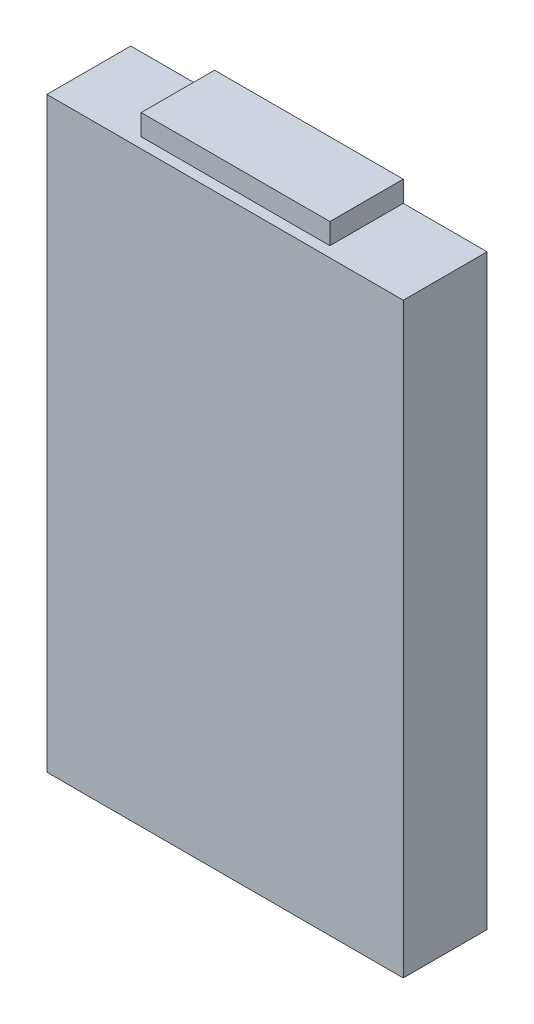
ISO-10303-21;
HEADER;
FILE_DESCRIPTION(('STEP AP214'),'2;1');
FILE_NAME('part.step','',(''),(''),'','','');
FILE_SCHEMA(('AUTOMOTIVE_DESIGN { 1 0 10303 214 1 1 1 1 }'));
ENDSEC;
DATA;
#1=APPLICATION_CONTEXT('core data for automotive mechanical design processes');
#2=APPLICATION_PROTOCOL_DEFINITION('international standard','automotive_design',2000,#1);
#3=PRODUCT_CONTEXT('',#1,'mechanical');
#4=PRODUCT('Part','Part','',(#3));
#5=PRODUCT_RELATED_PRODUCT_CATEGORY('part','',(#4));
#6=PRODUCT_DEFINITION_FORMATION('','',#4);
#7=PRODUCT_DEFINITION_CONTEXT('part definition',#1,'design');
#8=PRODUCT_DEFINITION('design','',#6,#7);
#9=PRODUCT_DEFINITION_SHAPE('','',#8);
#10=(LENGTH_UNIT() NAMED_UNIT(*) SI_UNIT(.MILLI.,.METRE.));
#11=(NAMED_UNIT(*) PLANE_ANGLE_UNIT() SI_UNIT($,.RADIAN.));
#12=(NAMED_UNIT(*) SI_UNIT($,.STERADIAN.) SOLID_ANGLE_UNIT());
#13=UNCERTAINTY_MEASURE_WITH_UNIT(LENGTH_MEASURE(1.E-05),#10,'distance_accuracy_value','');
#14=(GEOMETRIC_REPRESENTATION_CONTEXT(3) GLOBAL_UNCERTAINTY_ASSIGNED_CONTEXT((#13)) GLOBAL_UNIT_ASSIGNED_CONTEXT((#10,
#11,#12)) REPRESENTATION_CONTEXT('',''));
#15=CARTESIAN_POINT('',(0.,0.,0.));
#16=DIRECTION('',(0.,0.,1.));
#17=DIRECTION('',(1.,0.,0.));
#18=AXIS2_PLACEMENT_3D('',#15,#16,#17);
#19=CARTESIAN_POINT('',(0.,28.,4.));
#20=DIRECTION('',(0.,-1.,0.));
#21=DIRECTION('',(0.,0.,-1.));
#22=AXIS2_PLACEMENT_3D('',#19,#20,#21);
#23=PLANE('',#22);
#24=DIRECTION('',(0.,0.,1.));
#25=VECTOR('',#24,1.);
#26=CARTESIAN_POINT('',(4.,28.,0.));
#27=LINE('',#26,#25);
#28=CARTESIAN_POINT('',(4.,28.,0.));
#29=VERTEX_POINT('',#28);
#30=CARTESIAN_POINT('',(4.,28.,3.5));
#31=VERTEX_POINT('',#30);
#32=EDGE_CURVE('E53',#29,#31,#27,.T.);
#33=ORIENTED_EDGE('',*,*,#32,.F.);
#34=DIRECTION('',(-1.,0.,0.));
#35=VECTOR('',#34,1.);
#36=CARTESIAN_POINT('',(0.,28.,0.));
#37=LINE('',#36,#35);
#38=CARTESIAN_POINT('',(0.,28.,0.));
#39=VERTEX_POINT('',#38);
#40=EDGE_CURVE('E141',#29,#39,#37,.T.);
#41=ORIENTED_EDGE('',*,*,#40,.T.);
#42=DIRECTION('',(0.,0.,-1.));
#43=VECTOR('',#42,1.);
#44=CARTESIAN_POINT('',(0.,28.,4.));
#45=LINE('',#44,#43);
#46=CARTESIAN_POINT('',(0.,28.,4.));
#47=VERTEX_POINT('',#46);
#48=EDGE_CURVE('E136',#47,#39,#45,.T.);
#49=ORIENTED_EDGE('',*,*,#48,.F.);
#50=DIRECTION('',(-1.,0.,0.));
#51=VECTOR('',#50,1.);
#52=CARTESIAN_POINT('',(0.,28.,4.));
#53=LINE('',#52,#51);
#54=CARTESIAN_POINT('',(17.,28.,4.));
#55=VERTEX_POINT('',#54);
#56=EDGE_CURVE('E135',#55,#47,#53,.T.);
#57=ORIENTED_EDGE('',*,*,#56,.F.);
#58=DIRECTION('',(0.,0.,-1.));
#59=VECTOR('',#58,1.);
#60=CARTESIAN_POINT('',(17.,28.,4.));
#61=LINE('',#60,#59);
#62=CARTESIAN_POINT('',(17.,28.,0.));
#63=VERTEX_POINT('',#62);
#64=EDGE_CURVE('E145',#55,#63,#61,.T.);
#65=ORIENTED_EDGE('',*,*,#64,.T.);
#66=CARTESIAN_POINT('',(13.,28.,0.));
#67=VERTEX_POINT('',#66);
#68=EDGE_CURVE('E131',#63,#67,#37,.T.);
#69=ORIENTED_EDGE('',*,*,#68,.T.);
#70=DIRECTION('',(0.,0.,-1.));
#71=VECTOR('',#70,1.);
#72=CARTESIAN_POINT('',(13.,28.,0.));
#73=LINE('',#72,#71);
#74=CARTESIAN_POINT('',(13.,28.,3.5));
#75=VERTEX_POINT('',#74);
#76=EDGE_CURVE('E115',#75,#67,#73,.T.);
#77=ORIENTED_EDGE('',*,*,#76,.F.);
#78=DIRECTION('',(1.,0.,0.));
#79=VECTOR('',#78,1.);
#80=CARTESIAN_POINT('',(4.,28.,3.5));
#81=LINE('',#80,#79);
#82=EDGE_CURVE('E48',#31,#75,#81,.T.);
#83=ORIENTED_EDGE('',*,*,#82,.F.);
#84=EDGE_LOOP('',(#33,#41,#49,#57,#65,#69,#77,#83));
#85=FACE_BOUND('',#84,.T.);
#86=ADVANCED_FACE('F33',(#85),#23,.F.);
#87=CARTESIAN_POINT('',(0.,0.,4.));
#88=DIRECTION('',(1.,0.,0.));
#89=DIRECTION('',(0.,0.,-1.));
#90=AXIS2_PLACEMENT_3D('',#87,#88,#89);
#91=PLANE('',#90);
#92=DIRECTION('',(0.,-1.,0.));
#93=VECTOR('',#92,1.);
#94=CARTESIAN_POINT('',(0.,0.,0.));
#95=LINE('',#94,#93);
#96=CARTESIAN_POINT('',(0.,0.,0.));
#97=VERTEX_POINT('',#96);
#98=EDGE_CURVE('E118',#39,#97,#95,.T.);
#99=ORIENTED_EDGE('',*,*,#98,.T.);
#100=DIRECTION('',(0.,0.,-1.));
#101=VECTOR('',#100,1.);
#102=CARTESIAN_POINT('',(0.,0.,4.));
#103=LINE('',#102,#101);
#104=CARTESIAN_POINT('',(0.,0.,4.));
#105=VERTEX_POINT('',#104);
#106=EDGE_CURVE('E11',#105,#97,#103,.T.);
#107=ORIENTED_EDGE('',*,*,#106,.F.);
#108=DIRECTION('',(0.,-1.,0.));
#109=VECTOR('',#108,1.);
#110=CARTESIAN_POINT('',(0.,0.,4.));
#111=LINE('',#110,#109);
#112=EDGE_CURVE('E127',#47,#105,#111,.T.);
#113=ORIENTED_EDGE('',*,*,#112,.F.);
#114=ORIENTED_EDGE('',*,*,#48,.T.);
#115=EDGE_LOOP('',(#99,#107,#113,#114));
#116=FACE_BOUND('',#115,.T.);
#117=ADVANCED_FACE('F35',(#116),#91,.F.);
#118=CARTESIAN_POINT('',(0.,0.,4.));
#119=DIRECTION('',(0.,1.,0.));
#120=DIRECTION('',(0.,0.,1.));
#121=AXIS2_PLACEMENT_3D('',#118,#119,#120);
#122=PLANE('',#121);
#123=DIRECTION('',(1.,0.,0.));
#124=VECTOR('',#123,1.);
#125=CARTESIAN_POINT('',(0.,0.,0.));
#126=LINE('',#125,#124);
#127=CARTESIAN_POINT('',(17.,0.,0.));
#128=VERTEX_POINT('',#127);
#129=EDGE_CURVE('E121',#97,#128,#126,.T.);
#130=ORIENTED_EDGE('',*,*,#129,.T.);
#131=DIRECTION('',(0.,0.,-1.));
#132=VECTOR('',#131,1.);
#133=CARTESIAN_POINT('',(17.,0.,4.));
#134=LINE('',#133,#132);
#135=CARTESIAN_POINT('',(17.,0.,4.));
#136=VERTEX_POINT('',#135);
#137=EDGE_CURVE('E41',#136,#128,#134,.T.);
#138=ORIENTED_EDGE('',*,*,#137,.F.);
#139=DIRECTION('',(1.,0.,0.));
#140=VECTOR('',#139,1.);
#141=CARTESIAN_POINT('',(0.,0.,4.));
#142=LINE('',#141,#140);
#143=EDGE_CURVE('E130',#105,#136,#142,.T.);
#144=ORIENTED_EDGE('',*,*,#143,.F.);
#145=ORIENTED_EDGE('',*,*,#106,.T.);
#146=EDGE_LOOP('',(#130,#138,#144,#145));
#147=FACE_BOUND('',#146,.T.);
#148=ADVANCED_FACE('F178',(#147),#122,.F.);
#149=CARTESIAN_POINT('',(17.,0.,4.));
#150=DIRECTION('',(-1.,0.,0.));
#151=DIRECTION('',(0.,0.,1.));
#152=AXIS2_PLACEMENT_3D('',#149,#150,#151);
#153=PLANE('',#152);
#154=DIRECTION('',(0.,1.,0.));
#155=VECTOR('',#154,1.);
#156=CARTESIAN_POINT('',(17.,0.,0.));
#157=LINE('',#156,#155);
#158=EDGE_CURVE('E139',#128,#63,#157,.T.);
#159=ORIENTED_EDGE('',*,*,#158,.T.);
#160=ORIENTED_EDGE('',*,*,#64,.F.);
#161=DIRECTION('',(0.,1.,0.));
#162=VECTOR('',#161,1.);
#163=CARTESIAN_POINT('',(17.,0.,4.));
#164=LINE('',#163,#162);
#165=EDGE_CURVE('E133',#136,#55,#164,.T.);
#166=ORIENTED_EDGE('',*,*,#165,.F.);
#167=ORIENTED_EDGE('',*,*,#137,.T.);
#168=EDGE_LOOP('',(#159,#160,#166,#167));
#169=FACE_BOUND('',#168,.T.);
#170=ADVANCED_FACE('F152',(#169),#153,.F.);
#171=CARTESIAN_POINT('',(0.,0.,4.));
#172=DIRECTION('',(0.,0.,-1.));
#173=DIRECTION('',(-1.,0.,0.));
#174=AXIS2_PLACEMENT_3D('',#171,#172,#173);
#175=PLANE('',#174);
#176=ORIENTED_EDGE('',*,*,#112,.T.);
#177=ORIENTED_EDGE('',*,*,#143,.T.);
#178=ORIENTED_EDGE('',*,*,#165,.T.);
#179=ORIENTED_EDGE('',*,*,#56,.T.);
#180=EDGE_LOOP('',(#176,#177,#178,#179));
#181=FACE_BOUND('',#180,.T.);
#182=ADVANCED_FACE('F177',(#181),#175,.F.);
#183=CARTESIAN_POINT('',(0.,0.,0.));
#184=DIRECTION('',(0.,0.,-1.));
#185=DIRECTION('',(-1.,0.,0.));
#186=AXIS2_PLACEMENT_3D('',#183,#184,#185);
#187=PLANE('',#186);
#188=ORIENTED_EDGE('',*,*,#98,.F.);
#189=ORIENTED_EDGE('',*,*,#40,.F.);
#190=DIRECTION('',(0.,-1.,0.));
#191=VECTOR('',#190,1.);
#192=CARTESIAN_POINT('',(4.,29.,0.));
#193=LINE('',#192,#191);
#194=CARTESIAN_POINT('',(4.,29.,0.));
#195=VERTEX_POINT('',#194);
#196=EDGE_CURVE('E169',#195,#29,#193,.T.);
#197=ORIENTED_EDGE('',*,*,#196,.F.);
#198=DIRECTION('',(-1.,0.,0.));
#199=VECTOR('',#198,1.);
#200=CARTESIAN_POINT('',(4.,29.,0.));
#201=LINE('',#200,#199);
#202=CARTESIAN_POINT('',(13.,29.,0.));
#203=VERTEX_POINT('',#202);
#204=EDGE_CURVE('E111',#203,#195,#201,.T.);
#205=ORIENTED_EDGE('',*,*,#204,.F.);
#206=DIRECTION('',(0.,-1.,0.));
#207=VECTOR('',#206,1.);
#208=CARTESIAN_POINT('',(13.,29.,0.));
#209=LINE('',#208,#207);
#210=EDGE_CURVE('E123',#203,#67,#209,.T.);
#211=ORIENTED_EDGE('',*,*,#210,.T.);
#212=ORIENTED_EDGE('',*,*,#68,.F.);
#213=ORIENTED_EDGE('',*,*,#158,.F.);
#214=ORIENTED_EDGE('',*,*,#129,.F.);
#215=EDGE_LOOP('',(#188,#189,#197,#205,#211,#212,#213,#214));
#216=FACE_BOUND('',#215,.T.);
#217=ADVANCED_FACE('F158',(#216),#187,.T.);
#218=CARTESIAN_POINT('',(4.,29.,0.));
#219=DIRECTION('',(1.,0.,0.));
#220=DIRECTION('',(0.,0.,-1.));
#221=AXIS2_PLACEMENT_3D('',#218,#219,#220);
#222=PLANE('',#221);
#223=ORIENTED_EDGE('',*,*,#32,.T.);
#224=DIRECTION('',(0.,-1.,0.));
#225=VECTOR('',#224,1.);
#226=CARTESIAN_POINT('',(4.,29.,3.5));
#227=LINE('',#226,#225);
#228=CARTESIAN_POINT('',(4.,29.,3.5));
#229=VERTEX_POINT('',#228);
#230=EDGE_CURVE('E100',#229,#31,#227,.T.);
#231=ORIENTED_EDGE('',*,*,#230,.F.);
#232=DIRECTION('',(0.,0.,1.));
#233=VECTOR('',#232,1.);
#234=CARTESIAN_POINT('',(4.,29.,0.));
#235=LINE('',#234,#233);
#236=EDGE_CURVE('E106',#195,#229,#235,.T.);
#237=ORIENTED_EDGE('',*,*,#236,.F.);
#238=ORIENTED_EDGE('',*,*,#196,.T.);
#239=EDGE_LOOP('',(#223,#231,#237,#238));
#240=FACE_BOUND('',#239,.T.);
#241=ADVANCED_FACE('F117',(#240),#222,.F.);
#242=CARTESIAN_POINT('',(4.,29.,3.5));
#243=DIRECTION('',(0.,0.,-1.));
#244=DIRECTION('',(-1.,0.,0.));
#245=AXIS2_PLACEMENT_3D('',#242,#243,#244);
#246=PLANE('',#245);
#247=ORIENTED_EDGE('',*,*,#82,.T.);
#248=DIRECTION('',(0.,-1.,0.));
#249=VECTOR('',#248,1.);
#250=CARTESIAN_POINT('',(13.,29.,3.5));
#251=LINE('',#250,#249);
#252=CARTESIAN_POINT('',(13.,29.,3.5));
#253=VERTEX_POINT('',#252);
#254=EDGE_CURVE('E102',#253,#75,#251,.T.);
#255=ORIENTED_EDGE('',*,*,#254,.F.);
#256=DIRECTION('',(1.,0.,0.));
#257=VECTOR('',#256,1.);
#258=CARTESIAN_POINT('',(4.,29.,3.5));
#259=LINE('',#258,#257);
#260=EDGE_CURVE('E96',#229,#253,#259,.T.);
#261=ORIENTED_EDGE('',*,*,#260,.F.);
#262=ORIENTED_EDGE('',*,*,#230,.T.);
#263=EDGE_LOOP('',(#247,#255,#261,#262));
#264=FACE_BOUND('',#263,.T.);
#265=ADVANCED_FACE('F98',(#264),#246,.F.);
#266=CARTESIAN_POINT('',(13.,29.,0.));
#267=DIRECTION('',(-1.,0.,0.));
#268=DIRECTION('',(0.,0.,1.));
#269=AXIS2_PLACEMENT_3D('',#266,#267,#268);
#270=PLANE('',#269);
#271=ORIENTED_EDGE('',*,*,#76,.T.);
#272=ORIENTED_EDGE('',*,*,#210,.F.);
#273=DIRECTION('',(0.,0.,-1.));
#274=VECTOR('',#273,1.);
#275=CARTESIAN_POINT('',(13.,29.,0.));
#276=LINE('',#275,#274);
#277=EDGE_CURVE('E105',#253,#203,#276,.T.);
#278=ORIENTED_EDGE('',*,*,#277,.F.);
#279=ORIENTED_EDGE('',*,*,#254,.T.);
#280=EDGE_LOOP('',(#271,#272,#278,#279));
#281=FACE_BOUND('',#280,.T.);
#282=ADVANCED_FACE('F164',(#281),#270,.F.);
#283=CARTESIAN_POINT('',(0.,29.,0.));
#284=DIRECTION('',(0.,1.,0.));
#285=DIRECTION('',(0.,0.,1.));
#286=AXIS2_PLACEMENT_3D('',#283,#284,#285);
#287=PLANE('',#286);
#288=ORIENTED_EDGE('',*,*,#236,.T.);
#289=ORIENTED_EDGE('',*,*,#260,.T.);
#290=ORIENTED_EDGE('',*,*,#277,.T.);
#291=ORIENTED_EDGE('',*,*,#204,.T.);
#292=EDGE_LOOP('',(#288,#289,#290,#291));
#293=FACE_BOUND('',#292,.T.);
#294=ADVANCED_FACE('F109',(#293),#287,.T.);
#295=CLOSED_SHELL('',(#86,#117,#148,#170,#182,#217,#241,#265,#282,#294));
#296=MANIFOLD_SOLID_BREP('B2',#295);
#297=ADVANCED_BREP_SHAPE_REPRESENTATION('',(#18,#296),#14);
#298=SHAPE_DEFINITION_REPRESENTATION(#9,#297);
ENDSEC;
END-ISO-10303-21;
